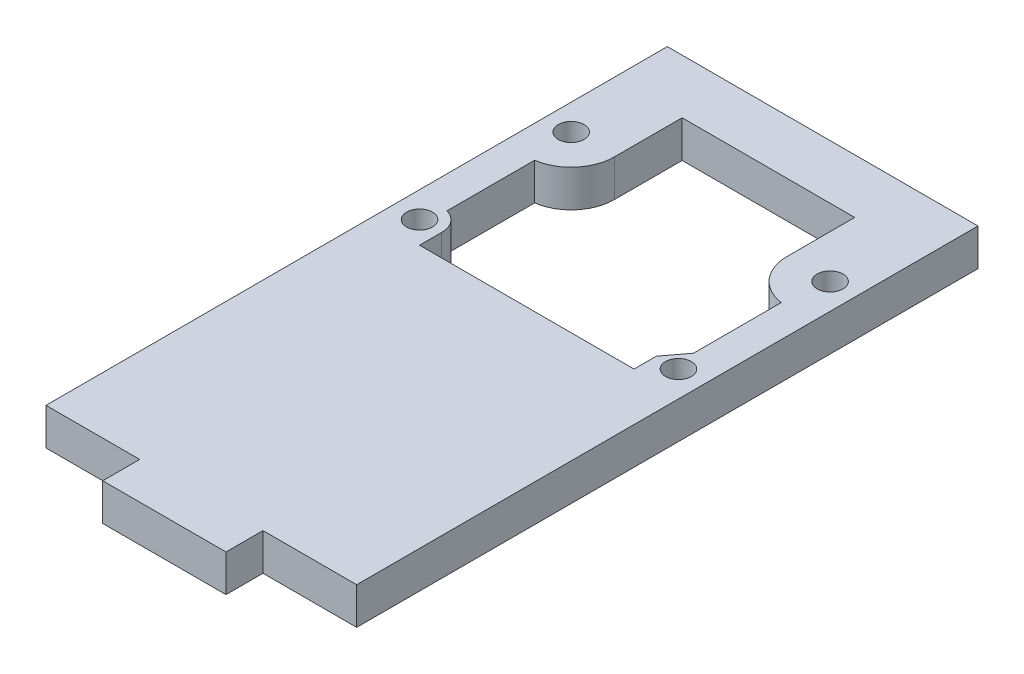
ISO-10303-21;
HEADER;
FILE_DESCRIPTION(('STEP AP214'),'2;1');
FILE_NAME('part.step','',(''),(''),'','','');
FILE_SCHEMA(('AUTOMOTIVE_DESIGN { 1 0 10303 214 1 1 1 1 }'));
ENDSEC;
DATA;
#1=APPLICATION_CONTEXT('core data for automotive mechanical design processes');
#2=APPLICATION_PROTOCOL_DEFINITION('international standard','automotive_design',2000,#1);
#3=PRODUCT_CONTEXT('',#1,'mechanical');
#4=PRODUCT('Part','Part','',(#3));
#5=PRODUCT_RELATED_PRODUCT_CATEGORY('part','',(#4));
#6=PRODUCT_DEFINITION_FORMATION('','',#4);
#7=PRODUCT_DEFINITION_CONTEXT('part definition',#1,'design');
#8=PRODUCT_DEFINITION('design','',#6,#7);
#9=PRODUCT_DEFINITION_SHAPE('','',#8);
#10=(LENGTH_UNIT() NAMED_UNIT(*) SI_UNIT(.MILLI.,.METRE.));
#11=(NAMED_UNIT(*) PLANE_ANGLE_UNIT() SI_UNIT($,.RADIAN.));
#12=(NAMED_UNIT(*) SI_UNIT($,.STERADIAN.) SOLID_ANGLE_UNIT());
#13=UNCERTAINTY_MEASURE_WITH_UNIT(LENGTH_MEASURE(1.E-05),#10,'distance_accuracy_value','');
#14=(GEOMETRIC_REPRESENTATION_CONTEXT(3) GLOBAL_UNCERTAINTY_ASSIGNED_CONTEXT((#13)) GLOBAL_UNIT_ASSIGNED_CONTEXT((#10,
#11,#12)) REPRESENTATION_CONTEXT('',''));
#15=CARTESIAN_POINT('',(0.,0.,0.));
#16=DIRECTION('',(0.,0.,1.));
#17=DIRECTION('',(1.,0.,0.));
#18=AXIS2_PLACEMENT_3D('',#15,#16,#17);
#19=CARTESIAN_POINT('',(0.,3.,0.));
#20=DIRECTION('',(0.,1.,0.));
#21=DIRECTION('',(0.,0.,1.));
#22=AXIS2_PLACEMENT_3D('',#19,#20,#21);
#23=PLANE('',#22);
#24=DIRECTION('',(-1.,0.,0.));
#25=VECTOR('',#24,1.);
#26=CARTESIAN_POINT('',(7.00000000000237,3.,-14.));
#27=LINE('',#26,#25);
#28=CARTESIAN_POINT('',(7.00000000000237,3.00000000000001,-14.));
#29=VERTEX_POINT('',#28);
#30=CARTESIAN_POINT('',(-6.99999999999987,3.,-14.));
#31=VERTEX_POINT('',#30);
#32=EDGE_CURVE('E291',#29,#31,#27,.T.);
#33=ORIENTED_EDGE('',*,*,#32,.F.);
#34=DIRECTION('',(0.,0.,1.));
#35=VECTOR('',#34,1.);
#36=CARTESIAN_POINT('',(7.00000000000112,3.,0.));
#37=LINE('',#36,#35);
#38=CARTESIAN_POINT('',(7.00000000000112,3.,-8.50000000000043));
#39=VERTEX_POINT('',#38);
#40=EDGE_CURVE('E276',#29,#39,#37,.T.);
#41=ORIENTED_EDGE('',*,*,#40,.T.);
#42=CARTESIAN_POINT('',(10.5000000000011,3.,-8.50000000000043));
#43=DIRECTION('',(0.,1.,0.));
#44=DIRECTION('',(0.,0.,1.));
#45=AXIS2_PLACEMENT_3D('',#42,#43,#44);
#46=CIRCLE('',#45,3.5);
#47=CARTESIAN_POINT('',(10.,3.,-5.03589838486284));
#48=VERTEX_POINT('',#47);
#49=EDGE_CURVE('E265',#39,#48,#46,.T.);
#50=ORIENTED_EDGE('',*,*,#49,.T.);
#51=DIRECTION('',(0.,0.,-1.));
#52=VECTOR('',#51,1.);
#53=CARTESIAN_POINT('',(10.,3.,0.));
#54=LINE('',#53,#52);
#55=CARTESIAN_POINT('',(10.,3.,2.0708383534208));
#56=VERTEX_POINT('',#55);
#57=EDGE_CURVE('E286',#56,#48,#54,.T.);
#58=ORIENTED_EDGE('',*,*,#57,.F.);
#59=DIRECTION('',(0.600925212577102,0.,-0.799305253885626));
#60=VECTOR('',#59,1.);
#61=CARTESIAN_POINT('',(7.38355951583597,3.,5.55102953478686));
#62=LINE('',#61,#60);
#63=CARTESIAN_POINT('',(8.70000000000099,3.,3.79999999999957));
#64=VERTEX_POINT('',#63);
#65=EDGE_CURVE('E442',#64,#56,#62,.T.);
#66=ORIENTED_EDGE('',*,*,#65,.F.);
#67=DIRECTION('',(0.,0.,-1.));
#68=VECTOR('',#67,1.);
#69=CARTESIAN_POINT('',(8.70000000000127,3.,6.28837260041561E-13));
#70=LINE('',#69,#68);
#71=CARTESIAN_POINT('',(8.70000000000086,3.,5.59999999999992));
#72=VERTEX_POINT('',#71);
#73=EDGE_CURVE('E445',#72,#64,#70,.T.);
#74=ORIENTED_EDGE('',*,*,#73,.F.);
#75=DIRECTION('',(1.,0.,0.));
#76=VECTOR('',#75,1.);
#77=CARTESIAN_POINT('',(0.,3.,5.59999999999992));
#78=LINE('',#77,#76);
#79=CARTESIAN_POINT('',(-8.70000000000112,3.,5.59999999999992));
#80=VERTEX_POINT('',#79);
#81=EDGE_CURVE('E448',#80,#72,#78,.T.);
#82=ORIENTED_EDGE('',*,*,#81,.F.);
#83=DIRECTION('',(0.,0.,-1.));
#84=VECTOR('',#83,1.);
#85=CARTESIAN_POINT('',(-8.70000000000112,3.,0.));
#86=LINE('',#85,#84);
#87=CARTESIAN_POINT('',(-8.70000000000112,3.,3.8));
#88=VERTEX_POINT('',#87);
#89=EDGE_CURVE('E451',#80,#88,#86,.T.);
#90=ORIENTED_EDGE('',*,*,#89,.T.);
#91=CARTESIAN_POINT('',(-10.5000000000011,3.,3.8));
#92=DIRECTION('',(0.,1.,0.));
#93=DIRECTION('',(0.,0.,1.));
#94=AXIS2_PLACEMENT_3D('',#91,#92,#93);
#95=CIRCLE('',#94,1.8);
#96=CARTESIAN_POINT('',(-10.0000000000001,3.,2.07083835342123));
#97=VERTEX_POINT('',#96);
#98=EDGE_CURVE('E455',#97,#88,#95,.F.);
#99=ORIENTED_EDGE('',*,*,#98,.F.);
#100=DIRECTION('',(0.,0.,-1.));
#101=VECTOR('',#100,1.);
#102=CARTESIAN_POINT('',(-10.0000000000001,3.,0.));
#103=LINE('',#102,#101);
#104=CARTESIAN_POINT('',(-10.0000000000001,3.,-5.03589838486232));
#105=VERTEX_POINT('',#104);
#106=EDGE_CURVE('E458',#97,#105,#103,.T.);
#107=ORIENTED_EDGE('',*,*,#106,.T.);
#108=CARTESIAN_POINT('',(-10.5000000000011,3.,-8.5));
#109=DIRECTION('',(0.,1.,0.));
#110=DIRECTION('',(0.,0.,1.));
#111=AXIS2_PLACEMENT_3D('',#108,#109,#110);
#112=CIRCLE('',#111,3.50000000000003);
#113=CARTESIAN_POINT('',(-7.00000000000109,3.,-8.5));
#114=VERTEX_POINT('',#113);
#115=EDGE_CURVE('E296',#105,#114,#112,.T.);
#116=ORIENTED_EDGE('',*,*,#115,.T.);
#117=DIRECTION('',(0.,0.,1.));
#118=VECTOR('',#117,1.);
#119=CARTESIAN_POINT('',(-7.00000000000112,3.,0.));
#120=LINE('',#119,#118);
#121=EDGE_CURVE('E261',#31,#114,#120,.T.);
#122=ORIENTED_EDGE('',*,*,#121,.F.);
#123=EDGE_LOOP('',(#33,#41,#50,#58,#66,#74,#82,#90,#99,#107,#116,#122));
#124=FACE_BOUND('',#123,.T.);
#125=CARTESIAN_POINT('',(10.500000000001,3.,3.79999999999957));
#126=DIRECTION('',(0.,1.,0.));
#127=DIRECTION('',(0.,0.,1.));
#128=AXIS2_PLACEMENT_3D('',#125,#126,#127);
#129=CIRCLE('',#128,1.05);
#130=CARTESIAN_POINT('',(10.500000000001,3.,4.84999999999957));
#131=VERTEX_POINT('',#130);
#132=EDGE_CURVE('E150',#131,#131,#129,.T.);
#133=ORIENTED_EDGE('',*,*,#132,.F.);
#134=EDGE_LOOP('',(#133));
#135=FACE_BOUND('',#134,.T.);
#136=CARTESIAN_POINT('',(-10.499999999999,3.,3.79999999999935));
#137=DIRECTION('',(0.,1.,0.));
#138=DIRECTION('',(0.,0.,1.));
#139=AXIS2_PLACEMENT_3D('',#136,#137,#138);
#140=CIRCLE('',#139,1.05);
#141=CARTESIAN_POINT('',(-10.499999999999,3.,4.84999999999935));
#142=VERTEX_POINT('',#141);
#143=EDGE_CURVE('E323',#142,#142,#140,.T.);
#144=ORIENTED_EDGE('',*,*,#143,.F.);
#145=EDGE_LOOP('',(#144));
#146=FACE_BOUND('',#145,.T.);
#147=CARTESIAN_POINT('',(-10.4999999999989,3.,-8.50000000000065));
#148=DIRECTION('',(0.,1.,0.));
#149=DIRECTION('',(0.,0.,1.));
#150=AXIS2_PLACEMENT_3D('',#147,#148,#149);
#151=CIRCLE('',#150,1.05);
#152=CARTESIAN_POINT('',(-10.4999999999989,3.,-7.45000000000065));
#153=VERTEX_POINT('',#152);
#154=EDGE_CURVE('E319',#153,#153,#151,.T.);
#155=ORIENTED_EDGE('',*,*,#154,.F.);
#156=EDGE_LOOP('',(#155));
#157=FACE_BOUND('',#156,.T.);
#158=CARTESIAN_POINT('',(10.5000000000011,3.,-8.50000000000043));
#159=DIRECTION('',(0.,1.,0.));
#160=DIRECTION('',(0.,0.,1.));
#161=AXIS2_PLACEMENT_3D('',#158,#159,#160);
#162=CIRCLE('',#161,1.05);
#163=CARTESIAN_POINT('',(10.5000000000011,3.,-7.45000000000043));
#164=VERTEX_POINT('',#163);
#165=EDGE_CURVE('E315',#164,#164,#162,.T.);
#166=ORIENTED_EDGE('',*,*,#165,.F.);
#167=EDGE_LOOP('',(#166));
#168=FACE_BOUND('',#167,.T.);
#169=DIRECTION('',(0.,0.,-1.));
#170=VECTOR('',#169,1.);
#171=CARTESIAN_POINT('',(12.6,3.,32.));
#172=LINE('',#171,#170);
#173=CARTESIAN_POINT('',(12.6,3.,32.));
#174=VERTEX_POINT('',#173);
#175=CARTESIAN_POINT('',(12.6000000000012,3.,-18.4000000000004));
#176=VERTEX_POINT('',#175);
#177=EDGE_CURVE('E139',#174,#176,#172,.T.);
#178=ORIENTED_EDGE('',*,*,#177,.T.);
#179=DIRECTION('',(1.,0.,0.));
#180=VECTOR('',#179,1.);
#181=CARTESIAN_POINT('',(-12.5999999999988,3.,-18.4000000000007));
#182=LINE('',#181,#180);
#183=CARTESIAN_POINT('',(-12.5999999999988,3.,-18.4000000000007));
#184=VERTEX_POINT('',#183);
#185=EDGE_CURVE('E195',#184,#176,#182,.T.);
#186=ORIENTED_EDGE('',*,*,#185,.F.);
#187=DIRECTION('',(0.,0.,1.));
#188=VECTOR('',#187,1.);
#189=CARTESIAN_POINT('',(-12.6,3.,-12.));
#190=LINE('',#189,#188);
#191=CARTESIAN_POINT('',(-12.6,3.,32.));
#192=VERTEX_POINT('',#191);
#193=EDGE_CURVE('E102',#184,#192,#190,.T.);
#194=ORIENTED_EDGE('',*,*,#193,.T.);
#195=DIRECTION('',(1.,0.,0.));
#196=VECTOR('',#195,1.);
#197=CARTESIAN_POINT('',(-12.6,3.,32.));
#198=LINE('',#197,#196);
#199=CARTESIAN_POINT('',(-5.,3.,32.));
#200=VERTEX_POINT('',#199);
#201=EDGE_CURVE('E332',#192,#200,#198,.T.);
#202=ORIENTED_EDGE('',*,*,#201,.T.);
#203=DIRECTION('',(0.,0.,1.));
#204=VECTOR('',#203,1.);
#205=CARTESIAN_POINT('',(-5.,3.,35.));
#206=LINE('',#205,#204);
#207=CARTESIAN_POINT('',(-5.,3.,35.));
#208=VERTEX_POINT('',#207);
#209=EDGE_CURVE('E118',#200,#208,#206,.T.);
#210=ORIENTED_EDGE('',*,*,#209,.T.);
#211=DIRECTION('',(1.,0.,0.));
#212=VECTOR('',#211,1.);
#213=CARTESIAN_POINT('',(0.,3.,35.));
#214=LINE('',#213,#212);
#215=CARTESIAN_POINT('',(5.,3.,35.));
#216=VERTEX_POINT('',#215);
#217=EDGE_CURVE('E112',#208,#216,#214,.T.);
#218=ORIENTED_EDGE('',*,*,#217,.T.);
#219=DIRECTION('',(0.,0.,-1.));
#220=VECTOR('',#219,1.);
#221=CARTESIAN_POINT('',(5.,3.,32.));
#222=LINE('',#221,#220);
#223=CARTESIAN_POINT('',(5.,3.,32.));
#224=VERTEX_POINT('',#223);
#225=EDGE_CURVE('E115',#216,#224,#222,.T.);
#226=ORIENTED_EDGE('',*,*,#225,.T.);
#227=DIRECTION('',(1.,0.,0.));
#228=VECTOR('',#227,1.);
#229=CARTESIAN_POINT('',(5.,3.,32.));
#230=LINE('',#229,#228);
#231=EDGE_CURVE('E66',#224,#174,#230,.T.);
#232=ORIENTED_EDGE('',*,*,#231,.T.);
#233=EDGE_LOOP('',(#178,#186,#194,#202,#210,#218,#226,#232));
#234=FACE_BOUND('',#233,.T.);
#235=ADVANCED_FACE('F41',(#124,#135,#146,#157,#168,#234),#23,.T.);
#236=CARTESIAN_POINT('',(0.,0.,0.));
#237=DIRECTION('',(0.,1.,0.));
#238=DIRECTION('',(0.,0.,1.));
#239=AXIS2_PLACEMENT_3D('',#236,#237,#238);
#240=PLANE('',#239);
#241=DIRECTION('',(0.,0.,-1.));
#242=VECTOR('',#241,1.);
#243=CARTESIAN_POINT('',(7.00000000000112,0.,-8.50000000000043));
#244=LINE('',#243,#242);
#245=CARTESIAN_POINT('',(7.00000000000112,0.,-8.50000000000043));
#246=VERTEX_POINT('',#245);
#247=CARTESIAN_POINT('',(7.00000000000237,0.,-14.));
#248=VERTEX_POINT('',#247);
#249=EDGE_CURVE('E284',#246,#248,#244,.T.);
#250=ORIENTED_EDGE('',*,*,#249,.T.);
#251=DIRECTION('',(-1.,0.,0.));
#252=VECTOR('',#251,1.);
#253=CARTESIAN_POINT('',(7.00000000000237,0.,-14.));
#254=LINE('',#253,#252);
#255=CARTESIAN_POINT('',(-6.99999999999987,0.,-14.));
#256=VERTEX_POINT('',#255);
#257=EDGE_CURVE('E352',#248,#256,#254,.T.);
#258=ORIENTED_EDGE('',*,*,#257,.T.);
#259=DIRECTION('',(0.,0.,-1.));
#260=VECTOR('',#259,1.);
#261=CARTESIAN_POINT('',(-7.00000000000112,0.,-8.5));
#262=LINE('',#261,#260);
#263=CARTESIAN_POINT('',(-7.00000000000109,0.,-8.5));
#264=VERTEX_POINT('',#263);
#265=EDGE_CURVE('E355',#264,#256,#262,.T.);
#266=ORIENTED_EDGE('',*,*,#265,.F.);
#267=CARTESIAN_POINT('',(-10.5000000000011,0.,-8.5));
#268=DIRECTION('',(0.,-1.,0.));
#269=DIRECTION('',(0.,0.,-1.));
#270=AXIS2_PLACEMENT_3D('',#267,#268,#269);
#271=CIRCLE('',#270,3.50000000000003);
#272=CARTESIAN_POINT('',(-10.0000000000001,0.,-5.03589838486232));
#273=VERTEX_POINT('',#272);
#274=EDGE_CURVE('E383',#264,#273,#271,.T.);
#275=ORIENTED_EDGE('',*,*,#274,.T.);
#276=DIRECTION('',(0.,0.,1.));
#277=VECTOR('',#276,1.);
#278=CARTESIAN_POINT('',(-10.0000000000001,0.,1.86350832689655));
#279=LINE('',#278,#277);
#280=CARTESIAN_POINT('',(-10.0000000000001,0.,2.07083835342123));
#281=VERTEX_POINT('',#280);
#282=EDGE_CURVE('E387',#273,#281,#279,.T.);
#283=ORIENTED_EDGE('',*,*,#282,.T.);
#284=CARTESIAN_POINT('',(-10.5000000000011,0.,3.8));
#285=DIRECTION('',(0.,1.,0.));
#286=DIRECTION('',(0.,0.,1.));
#287=AXIS2_PLACEMENT_3D('',#284,#285,#286);
#288=CIRCLE('',#287,1.8);
#289=CARTESIAN_POINT('',(-8.70000000000112,0.,3.8));
#290=VERTEX_POINT('',#289);
#291=EDGE_CURVE('E391',#290,#281,#288,.T.);
#292=ORIENTED_EDGE('',*,*,#291,.F.);
#293=DIRECTION('',(0.,0.,1.));
#294=VECTOR('',#293,1.);
#295=CARTESIAN_POINT('',(-8.70000000000112,0.,3.8));
#296=LINE('',#295,#294);
#297=CARTESIAN_POINT('',(-8.70000000000112,0.,5.59999999999992));
#298=VERTEX_POINT('',#297);
#299=EDGE_CURVE('E395',#290,#298,#296,.T.);
#300=ORIENTED_EDGE('',*,*,#299,.T.);
#301=DIRECTION('',(-1.,0.,0.));
#302=VECTOR('',#301,1.);
#303=CARTESIAN_POINT('',(8.70000000000086,0.,5.59999999999992));
#304=LINE('',#303,#302);
#305=CARTESIAN_POINT('',(8.70000000000086,0.,5.59999999999992));
#306=VERTEX_POINT('',#305);
#307=EDGE_CURVE('E399',#306,#298,#304,.T.);
#308=ORIENTED_EDGE('',*,*,#307,.F.);
#309=DIRECTION('',(0.,0.,1.));
#310=VECTOR('',#309,1.);
#311=CARTESIAN_POINT('',(8.70000000000099,0.,3.79999999999957));
#312=LINE('',#311,#310);
#313=CARTESIAN_POINT('',(8.70000000000099,0.,3.79999999999957));
#314=VERTEX_POINT('',#313);
#315=EDGE_CURVE('E403',#314,#306,#312,.T.);
#316=ORIENTED_EDGE('',*,*,#315,.F.);
#317=DIRECTION('',(-0.600925212577102,0.,0.799305253885626));
#318=VECTOR('',#317,1.);
#319=CARTESIAN_POINT('',(10.,0.,2.0708383534208));
#320=LINE('',#319,#318);
#321=CARTESIAN_POINT('',(10.,0.,2.0708383534208));
#322=VERTEX_POINT('',#321);
#323=EDGE_CURVE('E407',#322,#314,#320,.T.);
#324=ORIENTED_EDGE('',*,*,#323,.F.);
#325=DIRECTION('',(0.,0.,1.));
#326=VECTOR('',#325,1.);
#327=CARTESIAN_POINT('',(10.,0.,-5.03589838486284));
#328=LINE('',#327,#326);
#329=CARTESIAN_POINT('',(10.,0.,-5.03589838486284));
#330=VERTEX_POINT('',#329);
#331=EDGE_CURVE('E411',#330,#322,#328,.T.);
#332=ORIENTED_EDGE('',*,*,#331,.F.);
#333=CARTESIAN_POINT('',(10.5000000000011,0.,-8.50000000000043));
#334=DIRECTION('',(0.,-1.,0.));
#335=DIRECTION('',(0.,0.,-1.));
#336=AXIS2_PLACEMENT_3D('',#333,#334,#335);
#337=CIRCLE('',#336,3.5);
#338=EDGE_CURVE('E57',#330,#246,#337,.T.);
#339=ORIENTED_EDGE('',*,*,#338,.T.);
#340=EDGE_LOOP('',(#250,#258,#266,#275,#283,#292,#300,#308,#316,#324,#332,#339));
#341=FACE_BOUND('',#340,.T.);
#342=CARTESIAN_POINT('',(10.5000000000011,0.,-8.50000000000043));
#343=DIRECTION('',(0.,-1.,0.));
#344=DIRECTION('',(0.,0.,-1.));
#345=AXIS2_PLACEMENT_3D('',#342,#343,#344);
#346=CIRCLE('',#345,1.05);
#347=CARTESIAN_POINT('',(10.5000000000011,0.,-9.55000000000043));
#348=VERTEX_POINT('',#347);
#349=EDGE_CURVE('E304',#348,#348,#346,.T.);
#350=ORIENTED_EDGE('',*,*,#349,.F.);
#351=EDGE_LOOP('',(#350));
#352=FACE_BOUND('',#351,.T.);
#353=CARTESIAN_POINT('',(-10.4999999999989,0.,-8.50000000000065));
#354=DIRECTION('',(0.,-1.,0.));
#355=DIRECTION('',(0.,0.,-1.));
#356=AXIS2_PLACEMENT_3D('',#353,#354,#355);
#357=CIRCLE('',#356,1.05);
#358=CARTESIAN_POINT('',(-10.4999999999989,0.,-9.55000000000065));
#359=VERTEX_POINT('',#358);
#360=EDGE_CURVE('E300',#359,#359,#357,.T.);
#361=ORIENTED_EDGE('',*,*,#360,.F.);
#362=EDGE_LOOP('',(#361));
#363=FACE_BOUND('',#362,.T.);
#364=CARTESIAN_POINT('',(-10.499999999999,0.,3.79999999999935));
#365=DIRECTION('',(0.,-1.,0.));
#366=DIRECTION('',(0.,0.,-1.));
#367=AXIS2_PLACEMENT_3D('',#364,#365,#366);
#368=CIRCLE('',#367,1.05);
#369=CARTESIAN_POINT('',(-10.499999999999,0.,2.74999999999935));
#370=VERTEX_POINT('',#369);
#371=EDGE_CURVE('E305',#370,#370,#368,.T.);
#372=ORIENTED_EDGE('',*,*,#371,.F.);
#373=EDGE_LOOP('',(#372));
#374=FACE_BOUND('',#373,.T.);
#375=CARTESIAN_POINT('',(10.500000000001,0.,3.79999999999957));
#376=DIRECTION('',(0.,-1.,0.));
#377=DIRECTION('',(0.,0.,-1.));
#378=AXIS2_PLACEMENT_3D('',#375,#376,#377);
#379=CIRCLE('',#378,1.05);
#380=CARTESIAN_POINT('',(10.500000000001,0.,2.74999999999957));
#381=VERTEX_POINT('',#380);
#382=EDGE_CURVE('E275',#381,#381,#379,.T.);
#383=ORIENTED_EDGE('',*,*,#382,.F.);
#384=EDGE_LOOP('',(#383));
#385=FACE_BOUND('',#384,.T.);
#386=DIRECTION('',(1.,0.,0.));
#387=VECTOR('',#386,1.);
#388=CARTESIAN_POINT('',(-12.5999999999988,0.,-18.4000000000007));
#389=LINE('',#388,#387);
#390=CARTESIAN_POINT('',(-12.5999999999988,0.,-18.4000000000007));
#391=VERTEX_POINT('',#390);
#392=CARTESIAN_POINT('',(12.6000000000012,0.,-18.4000000000004));
#393=VERTEX_POINT('',#392);
#394=EDGE_CURVE('E341',#391,#393,#389,.T.);
#395=ORIENTED_EDGE('',*,*,#394,.T.);
#396=DIRECTION('',(0.,0.,-1.));
#397=VECTOR('',#396,1.);
#398=CARTESIAN_POINT('',(12.6,0.,-12.));
#399=LINE('',#398,#397);
#400=CARTESIAN_POINT('',(12.6,0.,32.));
#401=VERTEX_POINT('',#400);
#402=EDGE_CURVE('E94',#401,#393,#399,.T.);
#403=ORIENTED_EDGE('',*,*,#402,.F.);
#404=DIRECTION('',(1.,0.,0.));
#405=VECTOR('',#404,1.);
#406=CARTESIAN_POINT('',(5.,0.,32.));
#407=LINE('',#406,#405);
#408=CARTESIAN_POINT('',(5.,0.,32.));
#409=VERTEX_POINT('',#408);
#410=EDGE_CURVE('E162',#409,#401,#407,.T.);
#411=ORIENTED_EDGE('',*,*,#410,.F.);
#412=DIRECTION('',(0.,0.,-1.));
#413=VECTOR('',#412,1.);
#414=CARTESIAN_POINT('',(5.,0.,32.));
#415=LINE('',#414,#413);
#416=CARTESIAN_POINT('',(5.,0.,35.));
#417=VERTEX_POINT('',#416);
#418=EDGE_CURVE('E159',#417,#409,#415,.T.);
#419=ORIENTED_EDGE('',*,*,#418,.F.);
#420=DIRECTION('',(1.,0.,0.));
#421=VECTOR('',#420,1.);
#422=CARTESIAN_POINT('',(0.,0.,35.));
#423=LINE('',#422,#421);
#424=CARTESIAN_POINT('',(-5.,0.,35.));
#425=VERTEX_POINT('',#424);
#426=EDGE_CURVE('E127',#425,#417,#423,.T.);
#427=ORIENTED_EDGE('',*,*,#426,.F.);
#428=DIRECTION('',(0.,0.,1.));
#429=VECTOR('',#428,1.);
#430=CARTESIAN_POINT('',(-5.,0.,35.));
#431=LINE('',#430,#429);
#432=CARTESIAN_POINT('',(-5.,0.,32.));
#433=VERTEX_POINT('',#432);
#434=EDGE_CURVE('E153',#433,#425,#431,.T.);
#435=ORIENTED_EDGE('',*,*,#434,.F.);
#436=DIRECTION('',(1.,0.,0.));
#437=VECTOR('',#436,1.);
#438=CARTESIAN_POINT('',(-12.6,0.,32.));
#439=LINE('',#438,#437);
#440=CARTESIAN_POINT('',(-12.6,0.,32.));
#441=VERTEX_POINT('',#440);
#442=EDGE_CURVE('E149',#441,#433,#439,.T.);
#443=ORIENTED_EDGE('',*,*,#442,.F.);
#444=DIRECTION('',(0.,0.,1.));
#445=VECTOR('',#444,1.);
#446=CARTESIAN_POINT('',(-12.6,0.,12.));
#447=LINE('',#446,#445);
#448=EDGE_CURVE('E146',#391,#441,#447,.T.);
#449=ORIENTED_EDGE('',*,*,#448,.F.);
#450=EDGE_LOOP('',(#395,#403,#411,#419,#427,#435,#443,#449));
#451=FACE_BOUND('',#450,.T.);
#452=ADVANCED_FACE('F182',(#341,#352,#363,#374,#385,#451),#240,.F.);
#453=CARTESIAN_POINT('',(-12.6,3.,12.));
#454=DIRECTION('',(1.,0.,0.));
#455=DIRECTION('',(0.,0.,-1.));
#456=AXIS2_PLACEMENT_3D('',#453,#454,#455);
#457=PLANE('',#456);
#458=ORIENTED_EDGE('',*,*,#448,.T.);
#459=DIRECTION('',(0.,-1.,0.));
#460=VECTOR('',#459,1.);
#461=CARTESIAN_POINT('',(-12.6,3.,32.));
#462=LINE('',#461,#460);
#463=EDGE_CURVE('E11',#192,#441,#462,.T.);
#464=ORIENTED_EDGE('',*,*,#463,.F.);
#465=ORIENTED_EDGE('',*,*,#193,.F.);
#466=DIRECTION('',(0.,-1.,0.));
#467=VECTOR('',#466,1.);
#468=CARTESIAN_POINT('',(-12.5999999999988,29.0000000000002,-18.4000000000007));
#469=LINE('',#468,#467);
#470=EDGE_CURVE('E339',#184,#391,#469,.T.);
#471=ORIENTED_EDGE('',*,*,#470,.T.);
#472=EDGE_LOOP('',(#458,#464,#465,#471));
#473=FACE_BOUND('',#472,.T.);
#474=ADVANCED_FACE('F43',(#473),#457,.F.);
#475=CARTESIAN_POINT('',(-12.6,3.,32.));
#476=DIRECTION('',(0.,0.,-1.));
#477=DIRECTION('',(-1.,0.,0.));
#478=AXIS2_PLACEMENT_3D('',#475,#476,#477);
#479=PLANE('',#478);
#480=ORIENTED_EDGE('',*,*,#442,.T.);
#481=DIRECTION('',(0.,-1.,0.));
#482=VECTOR('',#481,1.);
#483=CARTESIAN_POINT('',(-5.,3.,32.));
#484=LINE('',#483,#482);
#485=EDGE_CURVE('E50',#200,#433,#484,.T.);
#486=ORIENTED_EDGE('',*,*,#485,.F.);
#487=ORIENTED_EDGE('',*,*,#201,.F.);
#488=ORIENTED_EDGE('',*,*,#463,.T.);
#489=EDGE_LOOP('',(#480,#486,#487,#488));
#490=FACE_BOUND('',#489,.T.);
#491=ADVANCED_FACE('F335',(#490),#479,.F.);
#492=CARTESIAN_POINT('',(-5.,3.,35.));
#493=DIRECTION('',(1.,0.,0.));
#494=DIRECTION('',(0.,0.,-1.));
#495=AXIS2_PLACEMENT_3D('',#492,#493,#494);
#496=PLANE('',#495);
#497=ORIENTED_EDGE('',*,*,#434,.T.);
#498=DIRECTION('',(0.,-1.,0.));
#499=VECTOR('',#498,1.);
#500=CARTESIAN_POINT('',(-5.,3.,35.));
#501=LINE('',#500,#499);
#502=EDGE_CURVE('E131',#208,#425,#501,.T.);
#503=ORIENTED_EDGE('',*,*,#502,.F.);
#504=ORIENTED_EDGE('',*,*,#209,.F.);
#505=ORIENTED_EDGE('',*,*,#485,.T.);
#506=EDGE_LOOP('',(#497,#503,#504,#505));
#507=FACE_BOUND('',#506,.T.);
#508=ADVANCED_FACE('F178',(#507),#496,.F.);
#509=CARTESIAN_POINT('',(0.,3.,35.));
#510=DIRECTION('',(0.,0.,-1.));
#511=DIRECTION('',(-1.,0.,0.));
#512=AXIS2_PLACEMENT_3D('',#509,#510,#511);
#513=PLANE('',#512);
#514=ORIENTED_EDGE('',*,*,#426,.T.);
#515=DIRECTION('',(0.,-1.,0.));
#516=VECTOR('',#515,1.);
#517=CARTESIAN_POINT('',(5.,3.,35.));
#518=LINE('',#517,#516);
#519=EDGE_CURVE('E125',#216,#417,#518,.T.);
#520=ORIENTED_EDGE('',*,*,#519,.F.);
#521=ORIENTED_EDGE('',*,*,#217,.F.);
#522=ORIENTED_EDGE('',*,*,#502,.T.);
#523=EDGE_LOOP('',(#514,#520,#521,#522));
#524=FACE_BOUND('',#523,.T.);
#525=ADVANCED_FACE('F126',(#524),#513,.F.);
#526=CARTESIAN_POINT('',(5.,3.,32.));
#527=DIRECTION('',(-1.,0.,0.));
#528=DIRECTION('',(0.,0.,1.));
#529=AXIS2_PLACEMENT_3D('',#526,#527,#528);
#530=PLANE('',#529);
#531=ORIENTED_EDGE('',*,*,#418,.T.);
#532=DIRECTION('',(0.,-1.,0.));
#533=VECTOR('',#532,1.);
#534=CARTESIAN_POINT('',(5.,3.,32.));
#535=LINE('',#534,#533);
#536=EDGE_CURVE('E132',#224,#409,#535,.T.);
#537=ORIENTED_EDGE('',*,*,#536,.F.);
#538=ORIENTED_EDGE('',*,*,#225,.F.);
#539=ORIENTED_EDGE('',*,*,#519,.T.);
#540=EDGE_LOOP('',(#531,#537,#538,#539));
#541=FACE_BOUND('',#540,.T.);
#542=ADVANCED_FACE('F134',(#541),#530,.F.);
#543=CARTESIAN_POINT('',(5.,3.,32.));
#544=DIRECTION('',(0.,0.,-1.));
#545=DIRECTION('',(-1.,0.,0.));
#546=AXIS2_PLACEMENT_3D('',#543,#544,#545);
#547=PLANE('',#546);
#548=ORIENTED_EDGE('',*,*,#410,.T.);
#549=DIRECTION('',(0.,-1.,0.));
#550=VECTOR('',#549,1.);
#551=CARTESIAN_POINT('',(12.6,3.,32.));
#552=LINE('',#551,#550);
#553=EDGE_CURVE('E145',#174,#401,#552,.T.);
#554=ORIENTED_EDGE('',*,*,#553,.F.);
#555=ORIENTED_EDGE('',*,*,#231,.F.);
#556=ORIENTED_EDGE('',*,*,#536,.T.);
#557=EDGE_LOOP('',(#548,#554,#555,#556));
#558=FACE_BOUND('',#557,.T.);
#559=ADVANCED_FACE('F185',(#558),#547,.F.);
#560=CARTESIAN_POINT('',(12.6,3.,-12.));
#561=DIRECTION('',(-1.,0.,0.));
#562=DIRECTION('',(0.,0.,1.));
#563=AXIS2_PLACEMENT_3D('',#560,#561,#562);
#564=PLANE('',#563);
#565=ORIENTED_EDGE('',*,*,#402,.T.);
#566=DIRECTION('',(0.,-1.,0.));
#567=VECTOR('',#566,1.);
#568=CARTESIAN_POINT('',(12.6000000000012,29.0000000000002,-18.4000000000004));
#569=LINE('',#568,#567);
#570=EDGE_CURVE('E192',#176,#393,#569,.T.);
#571=ORIENTED_EDGE('',*,*,#570,.F.);
#572=ORIENTED_EDGE('',*,*,#177,.F.);
#573=ORIENTED_EDGE('',*,*,#553,.T.);
#574=EDGE_LOOP('',(#565,#571,#572,#573));
#575=FACE_BOUND('',#574,.T.);
#576=ADVANCED_FACE('F189',(#575),#564,.F.);
#577=CARTESIAN_POINT('',(10.5000000000011,10.,-8.50000000000043));
#578=DIRECTION('',(0.,-1.,0.));
#579=DIRECTION('',(0.,0.,-1.));
#580=AXIS2_PLACEMENT_3D('',#577,#578,#579);
#581=CYLINDRICAL_SURFACE('',#580,1.05);
#582=ORIENTED_EDGE('',*,*,#165,.T.);
#583=EDGE_LOOP('',(#582));
#584=FACE_BOUND('',#583,.T.);
#585=ORIENTED_EDGE('',*,*,#349,.T.);
#586=EDGE_LOOP('',(#585));
#587=FACE_BOUND('',#586,.T.);
#588=ADVANCED_FACE('F490',(#584,#587),#581,.F.);
#589=CARTESIAN_POINT('',(-10.4999999999989,10.,-8.50000000000065));
#590=DIRECTION('',(0.,-1.,0.));
#591=DIRECTION('',(0.,0.,-1.));
#592=AXIS2_PLACEMENT_3D('',#589,#590,#591);
#593=CYLINDRICAL_SURFACE('',#592,1.05);
#594=ORIENTED_EDGE('',*,*,#154,.T.);
#595=EDGE_LOOP('',(#594));
#596=FACE_BOUND('',#595,.T.);
#597=ORIENTED_EDGE('',*,*,#360,.T.);
#598=EDGE_LOOP('',(#597));
#599=FACE_BOUND('',#598,.T.);
#600=ADVANCED_FACE('F520',(#596,#599),#593,.F.);
#601=CARTESIAN_POINT('',(-10.499999999999,10.,3.79999999999935));
#602=DIRECTION('',(0.,-1.,0.));
#603=DIRECTION('',(0.,0.,-1.));
#604=AXIS2_PLACEMENT_3D('',#601,#602,#603);
#605=CYLINDRICAL_SURFACE('',#604,1.05);
#606=ORIENTED_EDGE('',*,*,#143,.T.);
#607=EDGE_LOOP('',(#606));
#608=FACE_BOUND('',#607,.T.);
#609=ORIENTED_EDGE('',*,*,#371,.T.);
#610=EDGE_LOOP('',(#609));
#611=FACE_BOUND('',#610,.T.);
#612=ADVANCED_FACE('F528',(#608,#611),#605,.F.);
#613=CARTESIAN_POINT('',(10.500000000001,10.,3.79999999999957));
#614=DIRECTION('',(0.,-1.,0.));
#615=DIRECTION('',(0.,0.,-1.));
#616=AXIS2_PLACEMENT_3D('',#613,#614,#615);
#617=CYLINDRICAL_SURFACE('',#616,1.05);
#618=ORIENTED_EDGE('',*,*,#132,.T.);
#619=EDGE_LOOP('',(#618));
#620=FACE_BOUND('',#619,.T.);
#621=ORIENTED_EDGE('',*,*,#382,.T.);
#622=EDGE_LOOP('',(#621));
#623=FACE_BOUND('',#622,.T.);
#624=ADVANCED_FACE('F536',(#620,#623),#617,.F.);
#625=CARTESIAN_POINT('',(10.5000000000011,10.,-8.50000000000043));
#626=DIRECTION('',(0.,-1.,0.));
#627=DIRECTION('',(0.,0.,-1.));
#628=AXIS2_PLACEMENT_3D('',#625,#626,#627);
#629=CYLINDRICAL_SURFACE('',#628,3.5);
#630=DIRECTION('',(0.,-1.,0.));
#631=VECTOR('',#630,1.);
#632=CARTESIAN_POINT('',(7.00000000000112,10.,-8.50000000000043));
#633=LINE('',#632,#631);
#634=EDGE_CURVE('E268',#39,#246,#633,.T.);
#635=ORIENTED_EDGE('',*,*,#634,.T.);
#636=ORIENTED_EDGE('',*,*,#338,.F.);
#637=DIRECTION('',(0.,-1.,0.));
#638=VECTOR('',#637,1.);
#639=CARTESIAN_POINT('',(10.,10.,-5.03589838486284));
#640=LINE('',#639,#638);
#641=EDGE_CURVE('E270',#48,#330,#640,.T.);
#642=ORIENTED_EDGE('',*,*,#641,.F.);
#643=ORIENTED_EDGE('',*,*,#49,.F.);
#644=EDGE_LOOP('',(#635,#636,#642,#643));
#645=FACE_BOUND('',#644,.T.);
#646=ADVANCED_FACE('F267',(#645),#629,.T.);
#647=CARTESIAN_POINT('',(7.00000000000112,10.,-8.50000000000043));
#648=DIRECTION('',(-1.,0.,0.));
#649=DIRECTION('',(0.,0.,1.));
#650=AXIS2_PLACEMENT_3D('',#647,#648,#649);
#651=PLANE('',#650);
#652=ORIENTED_EDGE('',*,*,#40,.F.);
#653=DIRECTION('',(0.,-1.,0.));
#654=VECTOR('',#653,1.);
#655=CARTESIAN_POINT('',(7.00000000000237,29.0000000000002,-14.));
#656=LINE('',#655,#654);
#657=EDGE_CURVE('E357',#29,#248,#656,.T.);
#658=ORIENTED_EDGE('',*,*,#657,.T.);
#659=ORIENTED_EDGE('',*,*,#249,.F.);
#660=ORIENTED_EDGE('',*,*,#634,.F.);
#661=EDGE_LOOP('',(#652,#658,#659,#660));
#662=FACE_BOUND('',#661,.T.);
#663=ADVANCED_FACE('F280',(#662),#651,.T.);
#664=CARTESIAN_POINT('',(-7.00000000000112,10.,-8.5));
#665=DIRECTION('',(-1.,0.,0.));
#666=DIRECTION('',(0.,0.,1.));
#667=AXIS2_PLACEMENT_3D('',#664,#665,#666);
#668=PLANE('',#667);
#669=ORIENTED_EDGE('',*,*,#121,.T.);
#670=DIRECTION('',(0.,-1.,0.));
#671=VECTOR('',#670,1.);
#672=CARTESIAN_POINT('',(-7.00000000000109,10.,-8.5));
#673=LINE('',#672,#671);
#674=EDGE_CURVE('E287',#114,#264,#673,.T.);
#675=ORIENTED_EDGE('',*,*,#674,.T.);
#676=ORIENTED_EDGE('',*,*,#265,.T.);
#677=DIRECTION('',(0.,-1.,0.));
#678=VECTOR('',#677,1.);
#679=CARTESIAN_POINT('',(-6.99999999999987,29.0000000000002,-14.));
#680=LINE('',#679,#678);
#681=EDGE_CURVE('E363',#31,#256,#680,.T.);
#682=ORIENTED_EDGE('',*,*,#681,.F.);
#683=EDGE_LOOP('',(#669,#675,#676,#682));
#684=FACE_BOUND('',#683,.T.);
#685=ADVANCED_FACE('F473',(#684),#668,.F.);
#686=CARTESIAN_POINT('',(-10.5000000000011,10.,-8.5));
#687=DIRECTION('',(0.,-1.,0.));
#688=DIRECTION('',(0.,0.,-1.));
#689=AXIS2_PLACEMENT_3D('',#686,#687,#688);
#690=CYLINDRICAL_SURFACE('',#689,3.50000000000003);
#691=DIRECTION('',(0.,-1.,0.));
#692=VECTOR('',#691,1.);
#693=CARTESIAN_POINT('',(-10.0000000000001,10.,-5.03589838486232));
#694=LINE('',#693,#692);
#695=EDGE_CURVE('E435',#105,#273,#694,.T.);
#696=ORIENTED_EDGE('',*,*,#695,.T.);
#697=ORIENTED_EDGE('',*,*,#274,.F.);
#698=ORIENTED_EDGE('',*,*,#674,.F.);
#699=ORIENTED_EDGE('',*,*,#115,.F.);
#700=EDGE_LOOP('',(#696,#697,#698,#699));
#701=FACE_BOUND('',#700,.T.);
#702=ADVANCED_FACE('F466',(#701),#690,.T.);
#703=CARTESIAN_POINT('',(-10.0000000000001,10.,1.86350832689655));
#704=DIRECTION('',(1.,0.,0.));
#705=DIRECTION('',(0.,0.,-1.));
#706=AXIS2_PLACEMENT_3D('',#703,#704,#705);
#707=PLANE('',#706);
#708=DIRECTION('',(0.,-1.,0.));
#709=VECTOR('',#708,1.);
#710=CARTESIAN_POINT('',(-10.0000000000001,10.,2.07083835342123));
#711=LINE('',#710,#709);
#712=EDGE_CURVE('E432',#97,#281,#711,.T.);
#713=ORIENTED_EDGE('',*,*,#712,.T.);
#714=ORIENTED_EDGE('',*,*,#282,.F.);
#715=ORIENTED_EDGE('',*,*,#695,.F.);
#716=ORIENTED_EDGE('',*,*,#106,.F.);
#717=EDGE_LOOP('',(#713,#714,#715,#716));
#718=FACE_BOUND('',#717,.T.);
#719=ADVANCED_FACE('F470',(#718),#707,.T.);
#720=CARTESIAN_POINT('',(-10.5000000000011,10.,3.8));
#721=DIRECTION('',(0.,-1.,0.));
#722=DIRECTION('',(0.,0.,-1.));
#723=AXIS2_PLACEMENT_3D('',#720,#721,#722);
#724=CYLINDRICAL_SURFACE('',#723,1.8);
#725=ORIENTED_EDGE('',*,*,#98,.T.);
#726=DIRECTION('',(0.,-1.,0.));
#727=VECTOR('',#726,1.);
#728=CARTESIAN_POINT('',(-8.70000000000112,10.,3.8));
#729=LINE('',#728,#727);
#730=EDGE_CURVE('E429',#88,#290,#729,.T.);
#731=ORIENTED_EDGE('',*,*,#730,.T.);
#732=ORIENTED_EDGE('',*,*,#291,.T.);
#733=ORIENTED_EDGE('',*,*,#712,.F.);
#734=EDGE_LOOP('',(#725,#731,#732,#733));
#735=FACE_BOUND('',#734,.T.);
#736=ADVANCED_FACE('F602',(#735),#724,.T.);
#737=CARTESIAN_POINT('',(-8.70000000000112,10.,3.8));
#738=DIRECTION('',(1.,0.,0.));
#739=DIRECTION('',(0.,0.,-1.));
#740=AXIS2_PLACEMENT_3D('',#737,#738,#739);
#741=PLANE('',#740);
#742=DIRECTION('',(0.,-1.,0.));
#743=VECTOR('',#742,1.);
#744=CARTESIAN_POINT('',(-8.70000000000112,10.,5.59999999999992));
#745=LINE('',#744,#743);
#746=EDGE_CURVE('E426',#80,#298,#745,.T.);
#747=ORIENTED_EDGE('',*,*,#746,.T.);
#748=ORIENTED_EDGE('',*,*,#299,.F.);
#749=ORIENTED_EDGE('',*,*,#730,.F.);
#750=ORIENTED_EDGE('',*,*,#89,.F.);
#751=EDGE_LOOP('',(#747,#748,#749,#750));
#752=FACE_BOUND('',#751,.T.);
#753=ADVANCED_FACE('F598',(#752),#741,.T.);
#754=CARTESIAN_POINT('',(8.70000000000086,10.,5.59999999999992));
#755=DIRECTION('',(0.,0.,1.));
#756=DIRECTION('',(1.,0.,0.));
#757=AXIS2_PLACEMENT_3D('',#754,#755,#756);
#758=PLANE('',#757);
#759=ORIENTED_EDGE('',*,*,#81,.T.);
#760=DIRECTION('',(0.,-1.,0.));
#761=VECTOR('',#760,1.);
#762=CARTESIAN_POINT('',(8.70000000000086,10.,5.59999999999992));
#763=LINE('',#762,#761);
#764=EDGE_CURVE('E423',#72,#306,#763,.T.);
#765=ORIENTED_EDGE('',*,*,#764,.T.);
#766=ORIENTED_EDGE('',*,*,#307,.T.);
#767=ORIENTED_EDGE('',*,*,#746,.F.);
#768=EDGE_LOOP('',(#759,#765,#766,#767));
#769=FACE_BOUND('',#768,.T.);
#770=ADVANCED_FACE('F594',(#769),#758,.F.);
#771=CARTESIAN_POINT('',(8.70000000000099,10.,3.79999999999957));
#772=DIRECTION('',(1.,0.,0.));
#773=DIRECTION('',(0.,0.,-1.));
#774=AXIS2_PLACEMENT_3D('',#771,#772,#773);
#775=PLANE('',#774);
#776=ORIENTED_EDGE('',*,*,#73,.T.);
#777=DIRECTION('',(0.,-1.,0.));
#778=VECTOR('',#777,1.);
#779=CARTESIAN_POINT('',(8.70000000000099,10.,3.79999999999957));
#780=LINE('',#779,#778);
#781=EDGE_CURVE('E420',#64,#314,#780,.T.);
#782=ORIENTED_EDGE('',*,*,#781,.T.);
#783=ORIENTED_EDGE('',*,*,#315,.T.);
#784=ORIENTED_EDGE('',*,*,#764,.F.);
#785=EDGE_LOOP('',(#776,#782,#783,#784));
#786=FACE_BOUND('',#785,.T.);
#787=ADVANCED_FACE('F590',(#786),#775,.F.);
#788=CARTESIAN_POINT('',(10.,10.,2.0708383534208));
#789=DIRECTION('',(0.799305253885626,0.,0.600925212577102));
#790=DIRECTION('',(0.600925212577102,0.,-0.799305253885626));
#791=AXIS2_PLACEMENT_3D('',#788,#789,#790);
#792=PLANE('',#791);
#793=ORIENTED_EDGE('',*,*,#65,.T.);
#794=DIRECTION('',(0.,-1.,0.));
#795=VECTOR('',#794,1.);
#796=CARTESIAN_POINT('',(10.,10.,2.0708383534208));
#797=LINE('',#796,#795);
#798=EDGE_CURVE('E417',#56,#322,#797,.T.);
#799=ORIENTED_EDGE('',*,*,#798,.T.);
#800=ORIENTED_EDGE('',*,*,#323,.T.);
#801=ORIENTED_EDGE('',*,*,#781,.F.);
#802=EDGE_LOOP('',(#793,#799,#800,#801));
#803=FACE_BOUND('',#802,.T.);
#804=ADVANCED_FACE('F586',(#803),#792,.F.);
#805=CARTESIAN_POINT('',(10.,10.,-5.03589838486284));
#806=DIRECTION('',(1.,0.,0.));
#807=DIRECTION('',(0.,0.,-1.));
#808=AXIS2_PLACEMENT_3D('',#805,#806,#807);
#809=PLANE('',#808);
#810=ORIENTED_EDGE('',*,*,#57,.T.);
#811=ORIENTED_EDGE('',*,*,#641,.T.);
#812=ORIENTED_EDGE('',*,*,#331,.T.);
#813=ORIENTED_EDGE('',*,*,#798,.F.);
#814=EDGE_LOOP('',(#810,#811,#812,#813));
#815=FACE_BOUND('',#814,.T.);
#816=ADVANCED_FACE('F570',(#815),#809,.F.);
#817=CARTESIAN_POINT('',(7.00000000000237,29.0000000000002,-14.));
#818=DIRECTION('',(0.,0.,1.));
#819=DIRECTION('',(1.,0.,0.));
#820=AXIS2_PLACEMENT_3D('',#817,#818,#819);
#821=PLANE('',#820);
#822=ORIENTED_EDGE('',*,*,#657,.F.);
#823=ORIENTED_EDGE('',*,*,#32,.T.);
#824=ORIENTED_EDGE('',*,*,#681,.T.);
#825=ORIENTED_EDGE('',*,*,#257,.F.);
#826=EDGE_LOOP('',(#822,#823,#824,#825));
#827=FACE_BOUND('',#826,.T.);
#828=ADVANCED_FACE('F362',(#827),#821,.T.);
#829=CARTESIAN_POINT('',(-12.5999999999988,29.0000000000002,-18.4000000000007));
#830=DIRECTION('',(0.,0.,-1.));
#831=DIRECTION('',(-1.,0.,0.));
#832=AXIS2_PLACEMENT_3D('',#829,#830,#831);
#833=PLANE('',#832);
#834=ORIENTED_EDGE('',*,*,#470,.F.);
#835=ORIENTED_EDGE('',*,*,#185,.T.);
#836=ORIENTED_EDGE('',*,*,#570,.T.);
#837=ORIENTED_EDGE('',*,*,#394,.F.);
#838=EDGE_LOOP('',(#834,#835,#836,#837));
#839=FACE_BOUND('',#838,.T.);
#840=ADVANCED_FACE('F569',(#839),#833,.T.);
#841=CLOSED_SHELL('',(#235,#452,#474,#491,#508,#525,#542,#559,#576,#588,#600,#612,#624,#646,
#663,#685,#702,#719,#736,#753,#770,#787,#804,#816,#828,#840));
#842=MANIFOLD_SOLID_BREP('B2',#841);
#843=ADVANCED_BREP_SHAPE_REPRESENTATION('',(#18,#842),#14);
#844=SHAPE_DEFINITION_REPRESENTATION(#9,#843);
ENDSEC;
END-ISO-10303-21;
